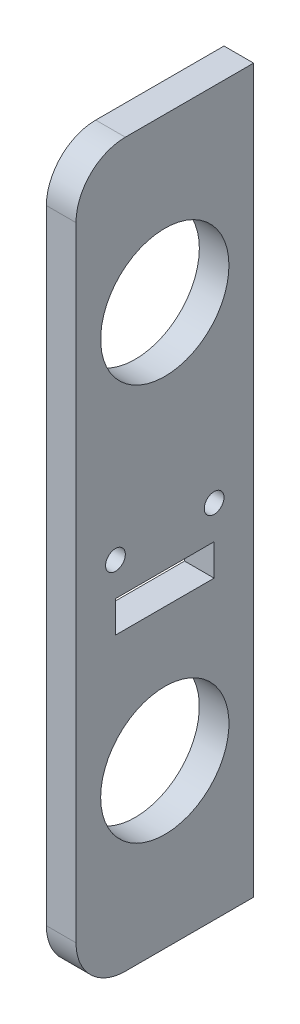
ISO-10303-21;
HEADER;
FILE_DESCRIPTION(('STEP AP214'),'2;1');
FILE_NAME('part.step','',(''),(''),'','','');
FILE_SCHEMA(('AUTOMOTIVE_DESIGN { 1 0 10303 214 1 1 1 1 }'));
ENDSEC;
DATA;
#1=APPLICATION_CONTEXT('core data for automotive mechanical design processes');
#2=APPLICATION_PROTOCOL_DEFINITION('international standard','automotive_design',2000,#1);
#3=PRODUCT_CONTEXT('',#1,'mechanical');
#4=PRODUCT('Part','Part','',(#3));
#5=PRODUCT_RELATED_PRODUCT_CATEGORY('part','',(#4));
#6=PRODUCT_DEFINITION_FORMATION('','',#4);
#7=PRODUCT_DEFINITION_CONTEXT('part definition',#1,'design');
#8=PRODUCT_DEFINITION('design','',#6,#7);
#9=PRODUCT_DEFINITION_SHAPE('','',#8);
#10=(LENGTH_UNIT() NAMED_UNIT(*) SI_UNIT(.MILLI.,.METRE.));
#11=(NAMED_UNIT(*) PLANE_ANGLE_UNIT() SI_UNIT($,.RADIAN.));
#12=(NAMED_UNIT(*) SI_UNIT($,.STERADIAN.) SOLID_ANGLE_UNIT());
#13=UNCERTAINTY_MEASURE_WITH_UNIT(LENGTH_MEASURE(1.E-05),#10,'distance_accuracy_value','');
#14=(GEOMETRIC_REPRESENTATION_CONTEXT(3) GLOBAL_UNCERTAINTY_ASSIGNED_CONTEXT((#13)) GLOBAL_UNIT_ASSIGNED_CONTEXT((#10,
#11,#12)) REPRESENTATION_CONTEXT('',''));
#15=CARTESIAN_POINT('',(0.,0.,0.));
#16=DIRECTION('',(0.,0.,1.));
#17=DIRECTION('',(1.,0.,0.));
#18=AXIS2_PLACEMENT_3D('',#15,#16,#17);
#19=CARTESIAN_POINT('',(3.,0.,0.));
#20=DIRECTION('',(1.,0.,0.));
#21=DIRECTION('',(0.,0.,-1.));
#22=AXIS2_PLACEMENT_3D('',#19,#20,#21);
#23=PLANE('',#22);
#24=CARTESIAN_POINT('',(3.,0.,5.));
#25=DIRECTION('',(1.,0.,0.));
#26=DIRECTION('',(0.,0.,-1.));
#27=AXIS2_PLACEMENT_3D('',#24,#25,#26);
#28=CIRCLE('',#27,1.);
#29=CARTESIAN_POINT('',(3.,0.,4.));
#30=VERTEX_POINT('',#29);
#31=EDGE_CURVE('E184',#30,#30,#28,.T.);
#32=ORIENTED_EDGE('',*,*,#31,.F.);
#33=EDGE_LOOP('',(#32));
#34=FACE_BOUND('',#33,.T.);
#35=CARTESIAN_POINT('',(3.,20.1,0.));
#36=DIRECTION('',(1.,0.,0.));
#37=DIRECTION('',(0.,0.,-1.));
#38=AXIS2_PLACEMENT_3D('',#35,#36,#37);
#39=CIRCLE('',#38,6.5);
#40=CARTESIAN_POINT('',(3.,20.1,-6.5));
#41=VERTEX_POINT('',#40);
#42=EDGE_CURVE('E200',#41,#41,#39,.T.);
#43=ORIENTED_EDGE('',*,*,#42,.F.);
#44=EDGE_LOOP('',(#43));
#45=FACE_BOUND('',#44,.T.);
#46=DIRECTION('',(0.,-1.,0.));
#47=VECTOR('',#46,1.);
#48=CARTESIAN_POINT('',(3.,-36.6,9.));
#49=LINE('',#48,#47);
#50=CARTESIAN_POINT('',(3.,31.6,9.));
#51=VERTEX_POINT('',#50);
#52=CARTESIAN_POINT('',(3.,-31.6,9.));
#53=VERTEX_POINT('',#52);
#54=EDGE_CURVE('E208',#51,#53,#49,.T.);
#55=ORIENTED_EDGE('',*,*,#54,.T.);
#56=CARTESIAN_POINT('',(3.,-31.6,4.));
#57=DIRECTION('',(1.,0.,0.));
#58=DIRECTION('',(0.,0.,-1.));
#59=AXIS2_PLACEMENT_3D('',#56,#57,#58);
#60=CIRCLE('',#59,5.);
#61=CARTESIAN_POINT('',(3.,-36.6,4.));
#62=VERTEX_POINT('',#61);
#63=EDGE_CURVE('E50',#53,#62,#60,.T.);
#64=ORIENTED_EDGE('',*,*,#63,.T.);
#65=DIRECTION('',(0.,0.,-1.));
#66=VECTOR('',#65,1.);
#67=CARTESIAN_POINT('',(3.,-36.6,-9.));
#68=LINE('',#67,#66);
#69=CARTESIAN_POINT('',(3.,-36.6,-9.));
#70=VERTEX_POINT('',#69);
#71=EDGE_CURVE('E211',#62,#70,#68,.T.);
#72=ORIENTED_EDGE('',*,*,#71,.T.);
#73=DIRECTION('',(0.,1.,0.));
#74=VECTOR('',#73,1.);
#75=CARTESIAN_POINT('',(3.,-36.6,-9.));
#76=LINE('',#75,#74);
#77=CARTESIAN_POINT('',(3.,36.6,-9.));
#78=VERTEX_POINT('',#77);
#79=EDGE_CURVE('E215',#70,#78,#76,.T.);
#80=ORIENTED_EDGE('',*,*,#79,.T.);
#81=DIRECTION('',(0.,0.,1.));
#82=VECTOR('',#81,1.);
#83=CARTESIAN_POINT('',(3.,36.6,-9.));
#84=LINE('',#83,#82);
#85=CARTESIAN_POINT('',(3.,36.6,4.));
#86=VERTEX_POINT('',#85);
#87=EDGE_CURVE('E218',#78,#86,#84,.T.);
#88=ORIENTED_EDGE('',*,*,#87,.T.);
#89=CARTESIAN_POINT('',(3.,31.6,4.));
#90=DIRECTION('',(1.,0.,0.));
#91=DIRECTION('',(0.,0.,-1.));
#92=AXIS2_PLACEMENT_3D('',#89,#90,#91);
#93=CIRCLE('',#92,5.);
#94=EDGE_CURVE('E255',#86,#51,#93,.T.);
#95=ORIENTED_EDGE('',*,*,#94,.T.);
#96=EDGE_LOOP('',(#55,#64,#72,#80,#88,#95));
#97=FACE_BOUND('',#96,.T.);
#98=CARTESIAN_POINT('',(3.,-20.1,0.));
#99=DIRECTION('',(1.,0.,0.));
#100=DIRECTION('',(0.,0.,1.));
#101=AXIS2_PLACEMENT_3D('',#98,#99,#100);
#102=CIRCLE('',#101,6.5);
#103=CARTESIAN_POINT('',(3.,-20.1,6.5));
#104=VERTEX_POINT('',#103);
#105=EDGE_CURVE('E192',#104,#104,#102,.T.);
#106=ORIENTED_EDGE('',*,*,#105,.F.);
#107=EDGE_LOOP('',(#106));
#108=FACE_BOUND('',#107,.T.);
#109=CARTESIAN_POINT('',(3.,0.,-4.99999999999999));
#110=DIRECTION('',(1.,0.,0.));
#111=DIRECTION('',(0.,0.,1.));
#112=AXIS2_PLACEMENT_3D('',#109,#110,#111);
#113=CIRCLE('',#112,1.);
#114=CARTESIAN_POINT('',(3.,0.,-3.99999999999999));
#115=VERTEX_POINT('',#114);
#116=EDGE_CURVE('E176',#115,#115,#113,.T.);
#117=ORIENTED_EDGE('',*,*,#116,.F.);
#118=EDGE_LOOP('',(#117));
#119=FACE_BOUND('',#118,.T.);
#120=DIRECTION('',(0.,0.,1.));
#121=VECTOR('',#120,1.);
#122=CARTESIAN_POINT('',(3.,-3.39999999999998,4.99999999999999));
#123=LINE('',#122,#121);
#124=CARTESIAN_POINT('',(3.,-3.39999999999998,-5.00000000000001));
#125=VERTEX_POINT('',#124);
#126=CARTESIAN_POINT('',(3.,-3.39999999999998,4.99999999999999));
#127=VERTEX_POINT('',#126);
#128=EDGE_CURVE('E133',#125,#127,#123,.T.);
#129=ORIENTED_EDGE('',*,*,#128,.F.);
#130=DIRECTION('',(0.,1.,0.));
#131=VECTOR('',#130,1.);
#132=CARTESIAN_POINT('',(3.,-6.59999999999998,-5.00000000000001));
#133=LINE('',#132,#131);
#134=CARTESIAN_POINT('',(3.,-6.59999999999998,-5.00000000000001));
#135=VERTEX_POINT('',#134);
#136=EDGE_CURVE('E122',#135,#125,#133,.T.);
#137=ORIENTED_EDGE('',*,*,#136,.F.);
#138=DIRECTION('',(0.,0.,-1.));
#139=VECTOR('',#138,1.);
#140=CARTESIAN_POINT('',(3.,-6.59999999999998,4.99999999999999));
#141=LINE('',#140,#139);
#142=CARTESIAN_POINT('',(3.,-6.59999999999998,4.99999999999999));
#143=VERTEX_POINT('',#142);
#144=EDGE_CURVE('E152',#143,#135,#141,.T.);
#145=ORIENTED_EDGE('',*,*,#144,.F.);
#146=DIRECTION('',(0.,-1.,0.));
#147=VECTOR('',#146,1.);
#148=CARTESIAN_POINT('',(3.,-6.59999999999998,4.99999999999999));
#149=LINE('',#148,#147);
#150=EDGE_CURVE('E147',#127,#143,#149,.T.);
#151=ORIENTED_EDGE('',*,*,#150,.F.);
#152=EDGE_LOOP('',(#129,#137,#145,#151));
#153=FACE_BOUND('',#152,.T.);
#154=ADVANCED_FACE('F41',(#34,#45,#97,#108,#119,#153),#23,.T.);
#155=CARTESIAN_POINT('',(0.,0.,0.));
#156=DIRECTION('',(1.,0.,0.));
#157=DIRECTION('',(0.,0.,-1.));
#158=AXIS2_PLACEMENT_3D('',#155,#156,#157);
#159=PLANE('',#158);
#160=CARTESIAN_POINT('',(0.,0.,-4.99999999999999));
#161=DIRECTION('',(1.,0.,0.));
#162=DIRECTION('',(0.,0.,1.));
#163=AXIS2_PLACEMENT_3D('',#160,#161,#162);
#164=CIRCLE('',#163,1.);
#165=CARTESIAN_POINT('',(0.,0.,-3.99999999999999));
#166=VERTEX_POINT('',#165);
#167=EDGE_CURVE('E142',#166,#166,#164,.T.);
#168=ORIENTED_EDGE('',*,*,#167,.T.);
#169=EDGE_LOOP('',(#168));
#170=FACE_BOUND('',#169,.T.);
#171=CARTESIAN_POINT('',(0.,0.,5.));
#172=DIRECTION('',(1.,0.,0.));
#173=DIRECTION('',(0.,0.,-1.));
#174=AXIS2_PLACEMENT_3D('',#171,#172,#173);
#175=CIRCLE('',#174,1.);
#176=CARTESIAN_POINT('',(0.,0.,4.));
#177=VERTEX_POINT('',#176);
#178=EDGE_CURVE('E180',#177,#177,#175,.T.);
#179=ORIENTED_EDGE('',*,*,#178,.T.);
#180=EDGE_LOOP('',(#179));
#181=FACE_BOUND('',#180,.T.);
#182=CARTESIAN_POINT('',(0.,-20.1,0.));
#183=DIRECTION('',(1.,0.,0.));
#184=DIRECTION('',(0.,0.,1.));
#185=AXIS2_PLACEMENT_3D('',#182,#183,#184);
#186=CIRCLE('',#185,6.5);
#187=CARTESIAN_POINT('',(0.,-20.1,6.5));
#188=VERTEX_POINT('',#187);
#189=EDGE_CURVE('E188',#188,#188,#186,.T.);
#190=ORIENTED_EDGE('',*,*,#189,.T.);
#191=EDGE_LOOP('',(#190));
#192=FACE_BOUND('',#191,.T.);
#193=CARTESIAN_POINT('',(0.,20.1,0.));
#194=DIRECTION('',(1.,0.,0.));
#195=DIRECTION('',(0.,0.,-1.));
#196=AXIS2_PLACEMENT_3D('',#193,#194,#195);
#197=CIRCLE('',#196,6.5);
#198=CARTESIAN_POINT('',(0.,20.1,-6.5));
#199=VERTEX_POINT('',#198);
#200=EDGE_CURVE('E196',#199,#199,#197,.T.);
#201=ORIENTED_EDGE('',*,*,#200,.T.);
#202=EDGE_LOOP('',(#201));
#203=FACE_BOUND('',#202,.T.);
#204=DIRECTION('',(0.,0.,-1.));
#205=VECTOR('',#204,1.);
#206=CARTESIAN_POINT('',(0.,-36.6,-9.));
#207=LINE('',#206,#205);
#208=CARTESIAN_POINT('',(0.,-36.6,4.));
#209=VERTEX_POINT('',#208);
#210=CARTESIAN_POINT('',(0.,-36.6,-9.));
#211=VERTEX_POINT('',#210);
#212=EDGE_CURVE('E224',#209,#211,#207,.T.);
#213=ORIENTED_EDGE('',*,*,#212,.F.);
#214=CARTESIAN_POINT('',(0.,-31.6,4.));
#215=DIRECTION('',(1.,0.,0.));
#216=DIRECTION('',(0.,0.,-1.));
#217=AXIS2_PLACEMENT_3D('',#214,#215,#216);
#218=CIRCLE('',#217,5.);
#219=CARTESIAN_POINT('',(0.,-31.6,9.));
#220=VERTEX_POINT('',#219);
#221=EDGE_CURVE('E246',#209,#220,#218,.F.);
#222=ORIENTED_EDGE('',*,*,#221,.T.);
#223=DIRECTION('',(0.,-1.,0.));
#224=VECTOR('',#223,1.);
#225=CARTESIAN_POINT('',(0.,-36.6,9.));
#226=LINE('',#225,#224);
#227=CARTESIAN_POINT('',(0.,31.6,9.));
#228=VERTEX_POINT('',#227);
#229=EDGE_CURVE('E204',#228,#220,#226,.T.);
#230=ORIENTED_EDGE('',*,*,#229,.F.);
#231=CARTESIAN_POINT('',(0.,31.6,4.));
#232=DIRECTION('',(1.,0.,0.));
#233=DIRECTION('',(0.,0.,-1.));
#234=AXIS2_PLACEMENT_3D('',#231,#232,#233);
#235=CIRCLE('',#234,5.);
#236=CARTESIAN_POINT('',(0.,36.6,4.));
#237=VERTEX_POINT('',#236);
#238=EDGE_CURVE('E243',#228,#237,#235,.F.);
#239=ORIENTED_EDGE('',*,*,#238,.T.);
#240=DIRECTION('',(0.,0.,1.));
#241=VECTOR('',#240,1.);
#242=CARTESIAN_POINT('',(0.,36.6,-9.));
#243=LINE('',#242,#241);
#244=CARTESIAN_POINT('',(0.,36.6,-9.));
#245=VERTEX_POINT('',#244);
#246=EDGE_CURVE('E212',#245,#237,#243,.T.);
#247=ORIENTED_EDGE('',*,*,#246,.F.);
#248=DIRECTION('',(0.,1.,0.));
#249=VECTOR('',#248,1.);
#250=CARTESIAN_POINT('',(0.,-36.6,-9.));
#251=LINE('',#250,#249);
#252=EDGE_CURVE('E227',#211,#245,#251,.T.);
#253=ORIENTED_EDGE('',*,*,#252,.F.);
#254=EDGE_LOOP('',(#213,#222,#230,#239,#247,#253));
#255=FACE_BOUND('',#254,.T.);
#256=DIRECTION('',(0.,1.,0.));
#257=VECTOR('',#256,1.);
#258=CARTESIAN_POINT('',(0.,-6.59999999999998,-5.00000000000001));
#259=LINE('',#258,#257);
#260=CARTESIAN_POINT('',(0.,-6.59999999999998,-5.00000000000001));
#261=VERTEX_POINT('',#260);
#262=CARTESIAN_POINT('',(0.,-3.39999999999998,-5.00000000000001));
#263=VERTEX_POINT('',#262);
#264=EDGE_CURVE('E157',#261,#263,#259,.T.);
#265=ORIENTED_EDGE('',*,*,#264,.T.);
#266=DIRECTION('',(0.,0.,1.));
#267=VECTOR('',#266,1.);
#268=CARTESIAN_POINT('',(0.,-3.39999999999998,4.99999999999999));
#269=LINE('',#268,#267);
#270=CARTESIAN_POINT('',(0.,-3.39999999999998,4.99999999999999));
#271=VERTEX_POINT('',#270);
#272=EDGE_CURVE('E140',#263,#271,#269,.T.);
#273=ORIENTED_EDGE('',*,*,#272,.T.);
#274=DIRECTION('',(0.,-1.,0.));
#275=VECTOR('',#274,1.);
#276=CARTESIAN_POINT('',(0.,-6.59999999999998,4.99999999999999));
#277=LINE('',#276,#275);
#278=CARTESIAN_POINT('',(0.,-6.59999999999998,4.99999999999999));
#279=VERTEX_POINT('',#278);
#280=EDGE_CURVE('E162',#271,#279,#277,.T.);
#281=ORIENTED_EDGE('',*,*,#280,.T.);
#282=DIRECTION('',(0.,0.,-1.));
#283=VECTOR('',#282,1.);
#284=CARTESIAN_POINT('',(0.,-6.59999999999998,4.99999999999999));
#285=LINE('',#284,#283);
#286=EDGE_CURVE('E134',#279,#261,#285,.T.);
#287=ORIENTED_EDGE('',*,*,#286,.T.);
#288=EDGE_LOOP('',(#265,#273,#281,#287));
#289=FACE_BOUND('',#288,.T.);
#290=ADVANCED_FACE('F273',(#170,#181,#192,#203,#255,#289),#159,.F.);
#291=CARTESIAN_POINT('',(3.,-36.6,9.));
#292=DIRECTION('',(0.,0.,-1.));
#293=DIRECTION('',(-1.,0.,0.));
#294=AXIS2_PLACEMENT_3D('',#291,#292,#293);
#295=PLANE('',#294);
#296=ORIENTED_EDGE('',*,*,#229,.T.);
#297=DIRECTION('',(-1.,0.,0.));
#298=VECTOR('',#297,1.);
#299=CARTESIAN_POINT('',(3.,-31.6,9.));
#300=LINE('',#299,#298);
#301=EDGE_CURVE('E63',#220,#53,#300,.F.);
#302=ORIENTED_EDGE('',*,*,#301,.T.);
#303=ORIENTED_EDGE('',*,*,#54,.F.);
#304=DIRECTION('',(-1.,0.,0.));
#305=VECTOR('',#304,1.);
#306=CARTESIAN_POINT('',(3.,31.6,9.));
#307=LINE('',#306,#305);
#308=EDGE_CURVE('E249',#51,#228,#307,.T.);
#309=ORIENTED_EDGE('',*,*,#308,.T.);
#310=EDGE_LOOP('',(#296,#302,#303,#309));
#311=FACE_BOUND('',#310,.T.);
#312=ADVANCED_FACE('F276',(#311),#295,.F.);
#313=CARTESIAN_POINT('',(3.,-36.6,-9.));
#314=DIRECTION('',(0.,1.,0.));
#315=DIRECTION('',(0.,0.,1.));
#316=AXIS2_PLACEMENT_3D('',#313,#314,#315);
#317=PLANE('',#316);
#318=ORIENTED_EDGE('',*,*,#71,.F.);
#319=DIRECTION('',(-1.,0.,0.));
#320=VECTOR('',#319,1.);
#321=CARTESIAN_POINT('',(3.,-36.6,4.));
#322=LINE('',#321,#320);
#323=EDGE_CURVE('E239',#62,#209,#322,.T.);
#324=ORIENTED_EDGE('',*,*,#323,.T.);
#325=ORIENTED_EDGE('',*,*,#212,.T.);
#326=DIRECTION('',(-1.,0.,0.));
#327=VECTOR('',#326,1.);
#328=CARTESIAN_POINT('',(3.,-36.6,-9.));
#329=LINE('',#328,#327);
#330=EDGE_CURVE('E235',#70,#211,#329,.T.);
#331=ORIENTED_EDGE('',*,*,#330,.F.);
#332=EDGE_LOOP('',(#318,#324,#325,#331));
#333=FACE_BOUND('',#332,.T.);
#334=ADVANCED_FACE('F267',(#333),#317,.F.);
#335=CARTESIAN_POINT('',(3.,-36.6,-9.));
#336=DIRECTION('',(0.,0.,1.));
#337=DIRECTION('',(1.,0.,0.));
#338=AXIS2_PLACEMENT_3D('',#335,#336,#337);
#339=PLANE('',#338);
#340=ORIENTED_EDGE('',*,*,#252,.T.);
#341=DIRECTION('',(-1.,0.,0.));
#342=VECTOR('',#341,1.);
#343=CARTESIAN_POINT('',(3.,36.6,-9.));
#344=LINE('',#343,#342);
#345=EDGE_CURVE('E221',#78,#245,#344,.T.);
#346=ORIENTED_EDGE('',*,*,#345,.F.);
#347=ORIENTED_EDGE('',*,*,#79,.F.);
#348=ORIENTED_EDGE('',*,*,#330,.T.);
#349=EDGE_LOOP('',(#340,#346,#347,#348));
#350=FACE_BOUND('',#349,.T.);
#351=ADVANCED_FACE('F284',(#350),#339,.F.);
#352=CARTESIAN_POINT('',(3.,36.6,-9.));
#353=DIRECTION('',(0.,-1.,0.));
#354=DIRECTION('',(0.,0.,-1.));
#355=AXIS2_PLACEMENT_3D('',#352,#353,#354);
#356=PLANE('',#355);
#357=ORIENTED_EDGE('',*,*,#246,.T.);
#358=DIRECTION('',(-1.,0.,0.));
#359=VECTOR('',#358,1.);
#360=CARTESIAN_POINT('',(3.,36.6,4.));
#361=LINE('',#360,#359);
#362=EDGE_CURVE('E11',#237,#86,#361,.F.);
#363=ORIENTED_EDGE('',*,*,#362,.T.);
#364=ORIENTED_EDGE('',*,*,#87,.F.);
#365=ORIENTED_EDGE('',*,*,#345,.T.);
#366=EDGE_LOOP('',(#357,#363,#364,#365));
#367=FACE_BOUND('',#366,.T.);
#368=ADVANCED_FACE('F281',(#367),#356,.F.);
#369=CARTESIAN_POINT('',(3.,20.1,0.));
#370=DIRECTION('',(-1.,0.,0.));
#371=DIRECTION('',(0.,0.,1.));
#372=AXIS2_PLACEMENT_3D('',#369,#370,#371);
#373=CYLINDRICAL_SURFACE('',#372,6.5);
#374=ORIENTED_EDGE('',*,*,#42,.T.);
#375=EDGE_LOOP('',(#374));
#376=FACE_BOUND('',#375,.T.);
#377=ORIENTED_EDGE('',*,*,#200,.F.);
#378=EDGE_LOOP('',(#377));
#379=FACE_BOUND('',#378,.T.);
#380=ADVANCED_FACE('F291',(#376,#379),#373,.F.);
#381=CARTESIAN_POINT('',(3.,-20.1,0.));
#382=DIRECTION('',(-1.,0.,0.));
#383=DIRECTION('',(0.,0.,1.));
#384=AXIS2_PLACEMENT_3D('',#381,#382,#383);
#385=CYLINDRICAL_SURFACE('',#384,6.5);
#386=ORIENTED_EDGE('',*,*,#105,.T.);
#387=EDGE_LOOP('',(#386));
#388=FACE_BOUND('',#387,.T.);
#389=ORIENTED_EDGE('',*,*,#189,.F.);
#390=EDGE_LOOP('',(#389));
#391=FACE_BOUND('',#390,.T.);
#392=ADVANCED_FACE('F308',(#388,#391),#385,.F.);
#393=CARTESIAN_POINT('',(3.,0.,5.));
#394=DIRECTION('',(-1.,0.,0.));
#395=DIRECTION('',(0.,0.,1.));
#396=AXIS2_PLACEMENT_3D('',#393,#394,#395);
#397=CYLINDRICAL_SURFACE('',#396,1.);
#398=ORIENTED_EDGE('',*,*,#31,.T.);
#399=EDGE_LOOP('',(#398));
#400=FACE_BOUND('',#399,.T.);
#401=ORIENTED_EDGE('',*,*,#178,.F.);
#402=EDGE_LOOP('',(#401));
#403=FACE_BOUND('',#402,.T.);
#404=ADVANCED_FACE('F312',(#400,#403),#397,.F.);
#405=CARTESIAN_POINT('',(3.,0.,-4.99999999999999));
#406=DIRECTION('',(-1.,0.,0.));
#407=DIRECTION('',(0.,0.,1.));
#408=AXIS2_PLACEMENT_3D('',#405,#406,#407);
#409=CYLINDRICAL_SURFACE('',#408,1.);
#410=ORIENTED_EDGE('',*,*,#116,.T.);
#411=EDGE_LOOP('',(#410));
#412=FACE_BOUND('',#411,.T.);
#413=ORIENTED_EDGE('',*,*,#167,.F.);
#414=EDGE_LOOP('',(#413));
#415=FACE_BOUND('',#414,.T.);
#416=ADVANCED_FACE('F316',(#412,#415),#409,.F.);
#417=CARTESIAN_POINT('',(3.,-6.59999999999998,-5.00000000000001));
#418=DIRECTION('',(0.,0.,1.));
#419=DIRECTION('',(1.,0.,0.));
#420=AXIS2_PLACEMENT_3D('',#417,#418,#419);
#421=PLANE('',#420);
#422=ORIENTED_EDGE('',*,*,#264,.F.);
#423=DIRECTION('',(-1.,0.,0.));
#424=VECTOR('',#423,1.);
#425=CARTESIAN_POINT('',(3.,-6.59999999999998,-5.00000000000001));
#426=LINE('',#425,#424);
#427=EDGE_CURVE('E128',#135,#261,#426,.T.);
#428=ORIENTED_EDGE('',*,*,#427,.F.);
#429=ORIENTED_EDGE('',*,*,#136,.T.);
#430=DIRECTION('',(-1.,0.,0.));
#431=VECTOR('',#430,1.);
#432=CARTESIAN_POINT('',(3.,-3.39999999999998,-5.00000000000001));
#433=LINE('',#432,#431);
#434=EDGE_CURVE('E125',#125,#263,#433,.T.);
#435=ORIENTED_EDGE('',*,*,#434,.T.);
#436=EDGE_LOOP('',(#422,#428,#429,#435));
#437=FACE_BOUND('',#436,.T.);
#438=ADVANCED_FACE('F124',(#437),#421,.T.);
#439=CARTESIAN_POINT('',(3.,-3.39999999999998,4.99999999999999));
#440=DIRECTION('',(0.,-1.,0.));
#441=DIRECTION('',(0.,0.,-1.));
#442=AXIS2_PLACEMENT_3D('',#439,#440,#441);
#443=PLANE('',#442);
#444=ORIENTED_EDGE('',*,*,#272,.F.);
#445=ORIENTED_EDGE('',*,*,#434,.F.);
#446=ORIENTED_EDGE('',*,*,#128,.T.);
#447=DIRECTION('',(-1.,0.,0.));
#448=VECTOR('',#447,1.);
#449=CARTESIAN_POINT('',(3.,-3.39999999999998,4.99999999999999));
#450=LINE('',#449,#448);
#451=EDGE_CURVE('E143',#127,#271,#450,.T.);
#452=ORIENTED_EDGE('',*,*,#451,.T.);
#453=EDGE_LOOP('',(#444,#445,#446,#452));
#454=FACE_BOUND('',#453,.T.);
#455=ADVANCED_FACE('F137',(#454),#443,.T.);
#456=CARTESIAN_POINT('',(3.,-6.59999999999998,4.99999999999999));
#457=DIRECTION('',(0.,0.,-1.));
#458=DIRECTION('',(-1.,0.,0.));
#459=AXIS2_PLACEMENT_3D('',#456,#457,#458);
#460=PLANE('',#459);
#461=ORIENTED_EDGE('',*,*,#280,.F.);
#462=ORIENTED_EDGE('',*,*,#451,.F.);
#463=ORIENTED_EDGE('',*,*,#150,.T.);
#464=DIRECTION('',(-1.,0.,0.));
#465=VECTOR('',#464,1.);
#466=CARTESIAN_POINT('',(3.,-6.59999999999998,4.99999999999999));
#467=LINE('',#466,#465);
#468=EDGE_CURVE('E171',#143,#279,#467,.T.);
#469=ORIENTED_EDGE('',*,*,#468,.T.);
#470=EDGE_LOOP('',(#461,#462,#463,#469));
#471=FACE_BOUND('',#470,.T.);
#472=ADVANCED_FACE('F325',(#471),#460,.T.);
#473=CARTESIAN_POINT('',(3.,-6.59999999999998,4.99999999999999));
#474=DIRECTION('',(0.,1.,0.));
#475=DIRECTION('',(0.,0.,1.));
#476=AXIS2_PLACEMENT_3D('',#473,#474,#475);
#477=PLANE('',#476);
#478=ORIENTED_EDGE('',*,*,#286,.F.);
#479=ORIENTED_EDGE('',*,*,#468,.F.);
#480=ORIENTED_EDGE('',*,*,#144,.T.);
#481=ORIENTED_EDGE('',*,*,#427,.T.);
#482=EDGE_LOOP('',(#478,#479,#480,#481));
#483=FACE_BOUND('',#482,.T.);
#484=ADVANCED_FACE('F328',(#483),#477,.T.);
#485=CARTESIAN_POINT('',(3.,-31.6,4.));
#486=DIRECTION('',(-1.,0.,0.));
#487=DIRECTION('',(0.,0.,1.));
#488=AXIS2_PLACEMENT_3D('',#485,#486,#487);
#489=CYLINDRICAL_SURFACE('',#488,5.);
#490=ORIENTED_EDGE('',*,*,#63,.F.);
#491=ORIENTED_EDGE('',*,*,#301,.F.);
#492=ORIENTED_EDGE('',*,*,#221,.F.);
#493=ORIENTED_EDGE('',*,*,#323,.F.);
#494=EDGE_LOOP('',(#490,#491,#492,#493));
#495=FACE_BOUND('',#494,.T.);
#496=ADVANCED_FACE('F270',(#495),#489,.T.);
#497=CARTESIAN_POINT('',(3.,31.6,4.));
#498=DIRECTION('',(-1.,0.,0.));
#499=DIRECTION('',(0.,0.,1.));
#500=AXIS2_PLACEMENT_3D('',#497,#498,#499);
#501=CYLINDRICAL_SURFACE('',#500,5.);
#502=ORIENTED_EDGE('',*,*,#94,.F.);
#503=ORIENTED_EDGE('',*,*,#362,.F.);
#504=ORIENTED_EDGE('',*,*,#238,.F.);
#505=ORIENTED_EDGE('',*,*,#308,.F.);
#506=EDGE_LOOP('',(#502,#503,#504,#505));
#507=FACE_BOUND('',#506,.T.);
#508=ADVANCED_FACE('F43',(#507),#501,.T.);
#509=CLOSED_SHELL('',(#154,#290,#312,#334,#351,#368,#380,#392,#404,#416,#438,#455,#472,#484,
#496,#508));
#510=MANIFOLD_SOLID_BREP('B2',#509);
#511=ADVANCED_BREP_SHAPE_REPRESENTATION('',(#18,#510),#14);
#512=SHAPE_DEFINITION_REPRESENTATION(#9,#511);
ENDSEC;
END-ISO-10303-21;
